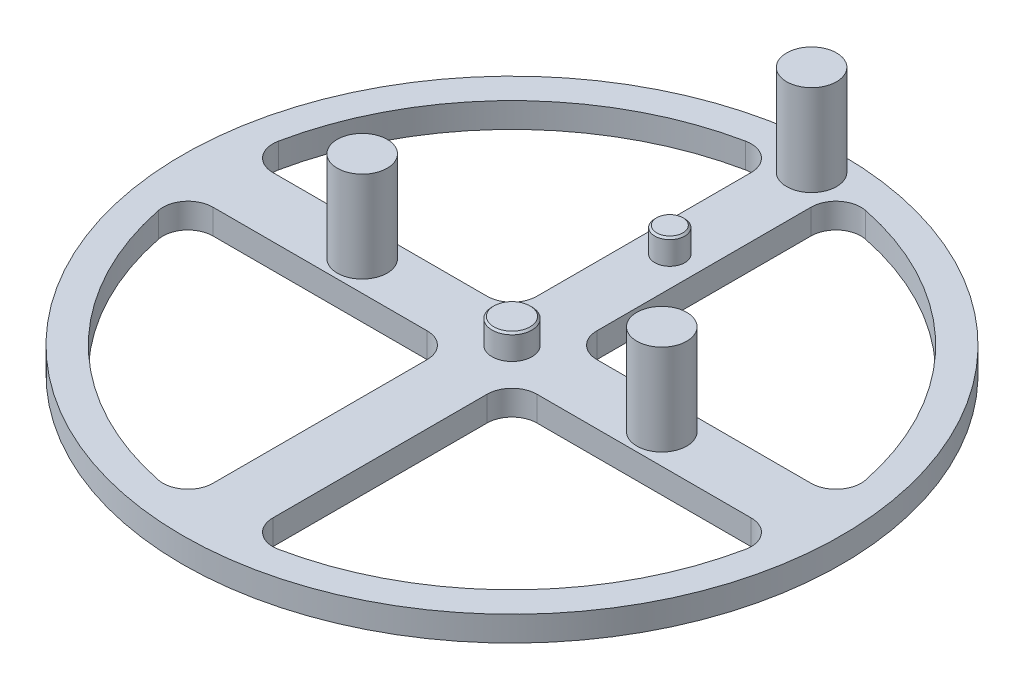
ISO-10303-21;
HEADER;
FILE_DESCRIPTION(('STEP AP214'),'2;1');
FILE_NAME('part.step','',(''),(''),'','','');
FILE_SCHEMA(('AUTOMOTIVE_DESIGN { 1 0 10303 214 1 1 1 1 }'));
ENDSEC;
DATA;
#1=APPLICATION_CONTEXT('core data for automotive mechanical design processes');
#2=APPLICATION_PROTOCOL_DEFINITION('international standard','automotive_design',2000,#1);
#3=PRODUCT_CONTEXT('',#1,'mechanical');
#4=PRODUCT('Part','Part','',(#3));
#5=PRODUCT_RELATED_PRODUCT_CATEGORY('part','',(#4));
#6=PRODUCT_DEFINITION_FORMATION('','',#4);
#7=PRODUCT_DEFINITION_CONTEXT('part definition',#1,'design');
#8=PRODUCT_DEFINITION('design','',#6,#7);
#9=PRODUCT_DEFINITION_SHAPE('','',#8);
#10=(LENGTH_UNIT() NAMED_UNIT(*) SI_UNIT(.MILLI.,.METRE.));
#11=(NAMED_UNIT(*) PLANE_ANGLE_UNIT() SI_UNIT($,.RADIAN.));
#12=(NAMED_UNIT(*) SI_UNIT($,.STERADIAN.) SOLID_ANGLE_UNIT());
#13=UNCERTAINTY_MEASURE_WITH_UNIT(LENGTH_MEASURE(1.E-05),#10,'distance_accuracy_value','');
#14=(GEOMETRIC_REPRESENTATION_CONTEXT(3) GLOBAL_UNCERTAINTY_ASSIGNED_CONTEXT((#13)) GLOBAL_UNIT_ASSIGNED_CONTEXT((#10,
#11,#12)) REPRESENTATION_CONTEXT('',''));
#15=CARTESIAN_POINT('',(0.,0.,0.));
#16=DIRECTION('',(0.,0.,1.));
#17=DIRECTION('',(1.,0.,0.));
#18=AXIS2_PLACEMENT_3D('',#15,#16,#17);
#19=CARTESIAN_POINT('',(0.,5.,0.));
#20=DIRECTION('',(0.,1.,0.));
#21=DIRECTION('',(0.,0.,1.));
#22=AXIS2_PLACEMENT_3D('',#19,#20,#21);
#23=PLANE('',#22);
#24=CARTESIAN_POINT('',(0.,5.,-60.));
#25=DIRECTION('',(0.,1.,0.));
#26=DIRECTION('',(0.,0.,1.));
#27=AXIS2_PLACEMENT_3D('',#24,#25,#26);
#28=CIRCLE('',#27,5.);
#29=CARTESIAN_POINT('',(0.,5.,-55.));
#30=VERTEX_POINT('',#29);
#31=EDGE_CURVE('E615',#30,#30,#28,.T.);
#32=ORIENTED_EDGE('',*,*,#31,.F.);
#33=EDGE_LOOP('',(#32));
#34=FACE_BOUND('',#33,.T.);
#35=CARTESIAN_POINT('',(30.,5.,0.));
#36=DIRECTION('',(0.,1.,0.));
#37=DIRECTION('',(0.,0.,1.));
#38=AXIS2_PLACEMENT_3D('',#35,#36,#37);
#39=CIRCLE('',#38,5.);
#40=CARTESIAN_POINT('',(30.,5.,5.));
#41=VERTEX_POINT('',#40);
#42=EDGE_CURVE('E11',#41,#41,#39,.T.);
#43=ORIENTED_EDGE('',*,*,#42,.F.);
#44=EDGE_LOOP('',(#43));
#45=FACE_BOUND('',#44,.T.);
#46=CARTESIAN_POINT('',(-30.,5.,0.));
#47=DIRECTION('',(0.,1.,0.));
#48=DIRECTION('',(0.,0.,1.));
#49=AXIS2_PLACEMENT_3D('',#46,#47,#48);
#50=CIRCLE('',#49,5.);
#51=CARTESIAN_POINT('',(-30.,5.,5.));
#52=VERTEX_POINT('',#51);
#53=EDGE_CURVE('E618',#52,#52,#50,.T.);
#54=ORIENTED_EDGE('',*,*,#53,.F.);
#55=EDGE_LOOP('',(#54));
#56=FACE_BOUND('',#55,.T.);
#57=CARTESIAN_POINT('',(0.,5.,-31.6));
#58=DIRECTION('',(0.,1.,0.));
#59=DIRECTION('',(0.,0.,1.));
#60=AXIS2_PLACEMENT_3D('',#57,#58,#59);
#61=CIRCLE('',#60,3.);
#62=CARTESIAN_POINT('',(0.,5.,-28.6));
#63=VERTEX_POINT('',#62);
#64=EDGE_CURVE('E626',#63,#63,#61,.T.);
#65=ORIENTED_EDGE('',*,*,#64,.F.);
#66=EDGE_LOOP('',(#65));
#67=FACE_BOUND('',#66,.T.);
#68=CARTESIAN_POINT('',(0.,5.,0.));
#69=DIRECTION('',(0.,1.,0.));
#70=DIRECTION('',(0.,0.,1.));
#71=AXIS2_PLACEMENT_3D('',#68,#69,#70);
#72=CIRCLE('',#71,4.);
#73=CARTESIAN_POINT('',(0.,5.,4.));
#74=VERTEX_POINT('',#73);
#75=EDGE_CURVE('E631',#74,#74,#72,.T.);
#76=ORIENTED_EDGE('',*,*,#75,.F.);
#77=EDGE_LOOP('',(#76));
#78=FACE_BOUND('',#77,.T.);
#79=CARTESIAN_POINT('',(0.,5.,0.));
#80=DIRECTION('',(0.,1.,0.));
#81=DIRECTION('',(0.,0.,1.));
#82=AXIS2_PLACEMENT_3D('',#79,#80,#81);
#83=CIRCLE('',#82,66.);
#84=CARTESIAN_POINT('',(0.,5.,66.));
#85=VERTEX_POINT('',#84);
#86=EDGE_CURVE('E223',#85,#85,#83,.T.);
#87=ORIENTED_EDGE('',*,*,#86,.T.);
#88=EDGE_LOOP('',(#87));
#89=FACE_BOUND('',#88,.T.);
#90=DIRECTION('',(0.,0.,-1.));
#91=VECTOR('',#90,1.);
#92=CARTESIAN_POINT('',(-6.,5.,59.6992462263972));
#93=LINE('',#92,#91);
#94=CARTESIAN_POINT('',(-6.,5.,53.8887743412299));
#95=VERTEX_POINT('',#94);
#96=CARTESIAN_POINT('',(-6.,5.,11.));
#97=VERTEX_POINT('',#96);
#98=EDGE_CURVE('E456',#95,#97,#93,.T.);
#99=ORIENTED_EDGE('',*,*,#98,.F.);
#100=CARTESIAN_POINT('',(-11.,5.,53.8887743412299));
#101=DIRECTION('',(0.,1.,0.));
#102=DIRECTION('',(0.,0.,1.));
#103=AXIS2_PLACEMENT_3D('',#100,#101,#102);
#104=CIRCLE('',#103,5.);
#105=CARTESIAN_POINT('',(-12.,5.,58.7877538267963));
#106=VERTEX_POINT('',#105);
#107=EDGE_CURVE('E286',#95,#106,#104,.F.);
#108=ORIENTED_EDGE('',*,*,#107,.T.);
#109=CARTESIAN_POINT('',(0.,5.,0.));
#110=DIRECTION('',(0.,1.,0.));
#111=DIRECTION('',(0.,0.,1.));
#112=AXIS2_PLACEMENT_3D('',#109,#110,#111);
#113=CIRCLE('',#112,60.);
#114=CARTESIAN_POINT('',(-58.7877538267963,5.,12.));
#115=VERTEX_POINT('',#114);
#116=EDGE_CURVE('E454',#115,#106,#113,.T.);
#117=ORIENTED_EDGE('',*,*,#116,.F.);
#118=CARTESIAN_POINT('',(-53.8887743412299,5.,11.));
#119=DIRECTION('',(0.,1.,0.));
#120=DIRECTION('',(0.,0.,1.));
#121=AXIS2_PLACEMENT_3D('',#118,#119,#120);
#122=CIRCLE('',#121,5.);
#123=CARTESIAN_POINT('',(-53.8887743412299,5.,5.99999999999998));
#124=VERTEX_POINT('',#123);
#125=EDGE_CURVE('E207',#115,#124,#122,.F.);
#126=ORIENTED_EDGE('',*,*,#125,.T.);
#127=DIRECTION('',(-1.,0.,0.));
#128=VECTOR('',#127,1.);
#129=CARTESIAN_POINT('',(-59.6992462263972,5.,5.99999999999998));
#130=LINE('',#129,#128);
#131=CARTESIAN_POINT('',(-11.,5.,6.));
#132=VERTEX_POINT('',#131);
#133=EDGE_CURVE('E459',#132,#124,#130,.T.);
#134=ORIENTED_EDGE('',*,*,#133,.F.);
#135=CARTESIAN_POINT('',(-11.,5.,11.));
#136=DIRECTION('',(0.,1.,0.));
#137=DIRECTION('',(0.,0.,1.));
#138=AXIS2_PLACEMENT_3D('',#135,#136,#137);
#139=CIRCLE('',#138,5.);
#140=EDGE_CURVE('E298',#132,#97,#139,.F.);
#141=ORIENTED_EDGE('',*,*,#140,.T.);
#142=EDGE_LOOP('',(#99,#108,#117,#126,#134,#141));
#143=FACE_BOUND('',#142,.T.);
#144=DIRECTION('',(1.,0.,0.));
#145=VECTOR('',#144,1.);
#146=CARTESIAN_POINT('',(-59.6992462263972,5.,-5.99999999999999));
#147=LINE('',#146,#145);
#148=CARTESIAN_POINT('',(-53.8887743412299,5.,-5.99999999999999));
#149=VERTEX_POINT('',#148);
#150=CARTESIAN_POINT('',(-11.,5.,-6.));
#151=VERTEX_POINT('',#150);
#152=EDGE_CURVE('E439',#149,#151,#147,.T.);
#153=ORIENTED_EDGE('',*,*,#152,.F.);
#154=CARTESIAN_POINT('',(-53.8887743412299,5.,-11.));
#155=DIRECTION('',(0.,1.,0.));
#156=DIRECTION('',(0.,0.,1.));
#157=AXIS2_PLACEMENT_3D('',#154,#155,#156);
#158=CIRCLE('',#157,5.);
#159=CARTESIAN_POINT('',(-58.7877538267963,5.,-12.));
#160=VERTEX_POINT('',#159);
#161=EDGE_CURVE('E48',#149,#160,#158,.F.);
#162=ORIENTED_EDGE('',*,*,#161,.T.);
#163=CARTESIAN_POINT('',(0.,5.,0.));
#164=DIRECTION('',(0.,1.,0.));
#165=DIRECTION('',(0.,0.,1.));
#166=AXIS2_PLACEMENT_3D('',#163,#164,#165);
#167=CIRCLE('',#166,60.);
#168=CARTESIAN_POINT('',(-12.,5.,-58.7877538267963));
#169=VERTEX_POINT('',#168);
#170=EDGE_CURVE('E433',#169,#160,#167,.T.);
#171=ORIENTED_EDGE('',*,*,#170,.F.);
#172=CARTESIAN_POINT('',(-11.,5.,-53.8887743412299));
#173=DIRECTION('',(0.,1.,0.));
#174=DIRECTION('',(0.,0.,1.));
#175=AXIS2_PLACEMENT_3D('',#172,#173,#174);
#176=CIRCLE('',#175,5.);
#177=CARTESIAN_POINT('',(-6.00000000000001,5.,-53.8887743412299));
#178=VERTEX_POINT('',#177);
#179=EDGE_CURVE('E325',#169,#178,#176,.F.);
#180=ORIENTED_EDGE('',*,*,#179,.T.);
#181=DIRECTION('',(0.,0.,-1.));
#182=VECTOR('',#181,1.);
#183=CARTESIAN_POINT('',(-6.,5.,-6.));
#184=LINE('',#183,#182);
#185=CARTESIAN_POINT('',(-6.,5.,-11.));
#186=VERTEX_POINT('',#185);
#187=EDGE_CURVE('E219',#186,#178,#184,.T.);
#188=ORIENTED_EDGE('',*,*,#187,.F.);
#189=CARTESIAN_POINT('',(-11.,5.,-11.));
#190=DIRECTION('',(0.,1.,0.));
#191=DIRECTION('',(0.,0.,1.));
#192=AXIS2_PLACEMENT_3D('',#189,#190,#191);
#193=CIRCLE('',#192,5.);
#194=EDGE_CURVE('E306',#186,#151,#193,.F.);
#195=ORIENTED_EDGE('',*,*,#194,.T.);
#196=EDGE_LOOP('',(#153,#162,#171,#180,#188,#195));
#197=FACE_BOUND('',#196,.T.);
#198=DIRECTION('',(-1.,0.,0.));
#199=VECTOR('',#198,1.);
#200=CARTESIAN_POINT('',(6.,5.,6.));
#201=LINE('',#200,#199);
#202=CARTESIAN_POINT('',(53.8887743412299,5.,5.99999999999998));
#203=VERTEX_POINT('',#202);
#204=CARTESIAN_POINT('',(11.,5.,6.));
#205=VERTEX_POINT('',#204);
#206=EDGE_CURVE('E656',#203,#205,#201,.T.);
#207=ORIENTED_EDGE('',*,*,#206,.F.);
#208=CARTESIAN_POINT('',(53.8887743412299,5.,11.));
#209=DIRECTION('',(0.,1.,0.));
#210=DIRECTION('',(0.,0.,1.));
#211=AXIS2_PLACEMENT_3D('',#208,#209,#210);
#212=CIRCLE('',#211,5.);
#213=CARTESIAN_POINT('',(58.7877538267963,5.,12.));
#214=VERTEX_POINT('',#213);
#215=EDGE_CURVE('E294',#203,#214,#212,.F.);
#216=ORIENTED_EDGE('',*,*,#215,.T.);
#217=CARTESIAN_POINT('',(0.,5.,0.));
#218=DIRECTION('',(0.,1.,0.));
#219=DIRECTION('',(0.,0.,1.));
#220=AXIS2_PLACEMENT_3D('',#217,#218,#219);
#221=CIRCLE('',#220,60.);
#222=CARTESIAN_POINT('',(12.,5.,58.7877538267963));
#223=VERTEX_POINT('',#222);
#224=EDGE_CURVE('E653',#223,#214,#221,.T.);
#225=ORIENTED_EDGE('',*,*,#224,.F.);
#226=CARTESIAN_POINT('',(11.,5.,53.8887743412299));
#227=DIRECTION('',(0.,1.,0.));
#228=DIRECTION('',(0.,0.,1.));
#229=AXIS2_PLACEMENT_3D('',#226,#227,#228);
#230=CIRCLE('',#229,5.);
#231=CARTESIAN_POINT('',(6.00000000000002,5.,53.8887743412299));
#232=VERTEX_POINT('',#231);
#233=EDGE_CURVE('E290',#223,#232,#230,.F.);
#234=ORIENTED_EDGE('',*,*,#233,.T.);
#235=DIRECTION('',(0.,0.,1.));
#236=VECTOR('',#235,1.);
#237=CARTESIAN_POINT('',(6.00000000000002,5.,59.6992462263972));
#238=LINE('',#237,#236);
#239=CARTESIAN_POINT('',(6.,5.,11.));
#240=VERTEX_POINT('',#239);
#241=EDGE_CURVE('E449',#240,#232,#238,.T.);
#242=ORIENTED_EDGE('',*,*,#241,.F.);
#243=CARTESIAN_POINT('',(11.,5.,11.));
#244=DIRECTION('',(0.,1.,0.));
#245=DIRECTION('',(0.,0.,1.));
#246=AXIS2_PLACEMENT_3D('',#243,#244,#245);
#247=CIRCLE('',#246,5.);
#248=EDGE_CURVE('E302',#240,#205,#247,.F.);
#249=ORIENTED_EDGE('',*,*,#248,.T.);
#250=EDGE_LOOP('',(#207,#216,#225,#234,#242,#249));
#251=FACE_BOUND('',#250,.T.);
#252=DIRECTION('',(0.,0.,1.));
#253=VECTOR('',#252,1.);
#254=CARTESIAN_POINT('',(6.,5.,-6.));
#255=LINE('',#254,#253);
#256=CARTESIAN_POINT('',(6.00000000000001,5.,-53.8887743412299));
#257=VERTEX_POINT('',#256);
#258=CARTESIAN_POINT('',(6.,5.,-11.));
#259=VERTEX_POINT('',#258);
#260=EDGE_CURVE('E638',#257,#259,#255,.T.);
#261=ORIENTED_EDGE('',*,*,#260,.F.);
#262=CARTESIAN_POINT('',(11.,5.,-53.8887743412299));
#263=DIRECTION('',(0.,1.,0.));
#264=DIRECTION('',(0.,0.,1.));
#265=AXIS2_PLACEMENT_3D('',#262,#263,#264);
#266=CIRCLE('',#265,5.);
#267=CARTESIAN_POINT('',(12.,5.,-58.7877538267963));
#268=VERTEX_POINT('',#267);
#269=EDGE_CURVE('E321',#257,#268,#266,.F.);
#270=ORIENTED_EDGE('',*,*,#269,.T.);
#271=CARTESIAN_POINT('',(0.,5.,0.));
#272=DIRECTION('',(0.,1.,0.));
#273=DIRECTION('',(0.,0.,1.));
#274=AXIS2_PLACEMENT_3D('',#271,#272,#273);
#275=CIRCLE('',#274,60.);
#276=CARTESIAN_POINT('',(58.7877538267963,5.,-12.));
#277=VERTEX_POINT('',#276);
#278=EDGE_CURVE('E635',#277,#268,#275,.T.);
#279=ORIENTED_EDGE('',*,*,#278,.F.);
#280=CARTESIAN_POINT('',(53.8887743412299,5.,-11.));
#281=DIRECTION('',(0.,1.,0.));
#282=DIRECTION('',(0.,0.,1.));
#283=AXIS2_PLACEMENT_3D('',#280,#281,#282);
#284=CIRCLE('',#283,5.);
#285=CARTESIAN_POINT('',(53.8887743412299,5.,-5.99999999999999));
#286=VERTEX_POINT('',#285);
#287=EDGE_CURVE('E208',#277,#286,#284,.F.);
#288=ORIENTED_EDGE('',*,*,#287,.T.);
#289=DIRECTION('',(1.,0.,0.));
#290=VECTOR('',#289,1.);
#291=CARTESIAN_POINT('',(6.,5.,-6.));
#292=LINE('',#291,#290);
#293=CARTESIAN_POINT('',(11.,5.,-6.));
#294=VERTEX_POINT('',#293);
#295=EDGE_CURVE('E642',#294,#286,#292,.T.);
#296=ORIENTED_EDGE('',*,*,#295,.F.);
#297=CARTESIAN_POINT('',(11.,5.,-11.));
#298=DIRECTION('',(0.,1.,0.));
#299=DIRECTION('',(0.,0.,1.));
#300=AXIS2_PLACEMENT_3D('',#297,#298,#299);
#301=CIRCLE('',#300,5.);
#302=EDGE_CURVE('E310',#294,#259,#301,.F.);
#303=ORIENTED_EDGE('',*,*,#302,.T.);
#304=EDGE_LOOP('',(#261,#270,#279,#288,#296,#303));
#305=FACE_BOUND('',#304,.T.);
#306=ADVANCED_FACE('F33',(#34,#45,#56,#67,#78,#89,#143,#197,#251,#305),#23,.T.);
#307=CARTESIAN_POINT('',(0.,0.,0.));
#308=DIRECTION('',(0.,1.,0.));
#309=DIRECTION('',(0.,0.,1.));
#310=AXIS2_PLACEMENT_3D('',#307,#308,#309);
#311=PLANE('',#310);
#312=DIRECTION('',(0.,0.,1.));
#313=VECTOR('',#312,1.);
#314=CARTESIAN_POINT('',(6.00000000000002,0.,59.6992462263972));
#315=LINE('',#314,#313);
#316=CARTESIAN_POINT('',(6.,0.,11.));
#317=VERTEX_POINT('',#316);
#318=CARTESIAN_POINT('',(6.00000000000002,0.,53.8887743412299));
#319=VERTEX_POINT('',#318);
#320=EDGE_CURVE('E657',#317,#319,#315,.T.);
#321=ORIENTED_EDGE('',*,*,#320,.T.);
#322=CARTESIAN_POINT('',(11.,0.,53.8887743412299));
#323=DIRECTION('',(0.,1.,0.));
#324=DIRECTION('',(0.,0.,1.));
#325=AXIS2_PLACEMENT_3D('',#322,#323,#324);
#326=CIRCLE('',#325,5.);
#327=CARTESIAN_POINT('',(12.,0.,58.7877538267963));
#328=VERTEX_POINT('',#327);
#329=EDGE_CURVE('E288',#319,#328,#326,.T.);
#330=ORIENTED_EDGE('',*,*,#329,.T.);
#331=CARTESIAN_POINT('',(0.,0.,0.));
#332=DIRECTION('',(0.,1.,0.));
#333=DIRECTION('',(0.,0.,1.));
#334=AXIS2_PLACEMENT_3D('',#331,#332,#333);
#335=CIRCLE('',#334,60.);
#336=CARTESIAN_POINT('',(58.7877538267963,0.,12.));
#337=VERTEX_POINT('',#336);
#338=EDGE_CURVE('E645',#328,#337,#335,.T.);
#339=ORIENTED_EDGE('',*,*,#338,.T.);
#340=CARTESIAN_POINT('',(53.8887743412299,0.,11.));
#341=DIRECTION('',(0.,1.,0.));
#342=DIRECTION('',(0.,0.,1.));
#343=AXIS2_PLACEMENT_3D('',#340,#341,#342);
#344=CIRCLE('',#343,5.);
#345=CARTESIAN_POINT('',(53.8887743412299,0.,5.99999999999998));
#346=VERTEX_POINT('',#345);
#347=EDGE_CURVE('E292',#337,#346,#344,.T.);
#348=ORIENTED_EDGE('',*,*,#347,.T.);
#349=DIRECTION('',(-1.,0.,0.));
#350=VECTOR('',#349,1.);
#351=CARTESIAN_POINT('',(6.,0.,6.));
#352=LINE('',#351,#350);
#353=CARTESIAN_POINT('',(11.,0.,6.));
#354=VERTEX_POINT('',#353);
#355=EDGE_CURVE('E664',#346,#354,#352,.T.);
#356=ORIENTED_EDGE('',*,*,#355,.T.);
#357=CARTESIAN_POINT('',(11.,0.,11.));
#358=DIRECTION('',(0.,1.,0.));
#359=DIRECTION('',(0.,0.,1.));
#360=AXIS2_PLACEMENT_3D('',#357,#358,#359);
#361=CIRCLE('',#360,5.);
#362=EDGE_CURVE('E300',#354,#317,#361,.T.);
#363=ORIENTED_EDGE('',*,*,#362,.T.);
#364=EDGE_LOOP('',(#321,#330,#339,#348,#356,#363));
#365=FACE_BOUND('',#364,.T.);
#366=DIRECTION('',(-1.,0.,0.));
#367=VECTOR('',#366,1.);
#368=CARTESIAN_POINT('',(-59.6992462263972,0.,5.99999999999998));
#369=LINE('',#368,#367);
#370=CARTESIAN_POINT('',(-11.,0.,6.));
#371=VERTEX_POINT('',#370);
#372=CARTESIAN_POINT('',(-53.8887743412299,0.,5.99999999999998));
#373=VERTEX_POINT('',#372);
#374=EDGE_CURVE('E202',#371,#373,#369,.T.);
#375=ORIENTED_EDGE('',*,*,#374,.T.);
#376=CARTESIAN_POINT('',(-53.8887743412299,0.,11.));
#377=DIRECTION('',(0.,1.,0.));
#378=DIRECTION('',(0.,0.,1.));
#379=AXIS2_PLACEMENT_3D('',#376,#377,#378);
#380=CIRCLE('',#379,5.);
#381=CARTESIAN_POINT('',(-58.7877538267963,0.,12.));
#382=VERTEX_POINT('',#381);
#383=EDGE_CURVE('E196',#373,#382,#380,.T.);
#384=ORIENTED_EDGE('',*,*,#383,.T.);
#385=CARTESIAN_POINT('',(0.,0.,0.));
#386=DIRECTION('',(0.,1.,0.));
#387=DIRECTION('',(0.,0.,1.));
#388=AXIS2_PLACEMENT_3D('',#385,#386,#387);
#389=CIRCLE('',#388,60.);
#390=CARTESIAN_POINT('',(-12.,0.,58.7877538267963));
#391=VERTEX_POINT('',#390);
#392=EDGE_CURVE('E200',#382,#391,#389,.T.);
#393=ORIENTED_EDGE('',*,*,#392,.T.);
#394=CARTESIAN_POINT('',(-11.,0.,53.8887743412299));
#395=DIRECTION('',(0.,1.,0.));
#396=DIRECTION('',(0.,0.,1.));
#397=AXIS2_PLACEMENT_3D('',#394,#395,#396);
#398=CIRCLE('',#397,5.);
#399=CARTESIAN_POINT('',(-6.,0.,53.8887743412299));
#400=VERTEX_POINT('',#399);
#401=EDGE_CURVE('E284',#391,#400,#398,.T.);
#402=ORIENTED_EDGE('',*,*,#401,.T.);
#403=DIRECTION('',(0.,0.,-1.));
#404=VECTOR('',#403,1.);
#405=CARTESIAN_POINT('',(-6.,0.,59.6992462263972));
#406=LINE('',#405,#404);
#407=CARTESIAN_POINT('',(-6.,0.,11.));
#408=VERTEX_POINT('',#407);
#409=EDGE_CURVE('E218',#400,#408,#406,.T.);
#410=ORIENTED_EDGE('',*,*,#409,.T.);
#411=CARTESIAN_POINT('',(-11.,0.,11.));
#412=DIRECTION('',(0.,1.,0.));
#413=DIRECTION('',(0.,0.,1.));
#414=AXIS2_PLACEMENT_3D('',#411,#412,#413);
#415=CIRCLE('',#414,5.);
#416=EDGE_CURVE('E296',#408,#371,#415,.T.);
#417=ORIENTED_EDGE('',*,*,#416,.T.);
#418=EDGE_LOOP('',(#375,#384,#393,#402,#410,#417));
#419=FACE_BOUND('',#418,.T.);
#420=CARTESIAN_POINT('',(0.,0.,0.));
#421=DIRECTION('',(0.,1.,0.));
#422=DIRECTION('',(0.,0.,1.));
#423=AXIS2_PLACEMENT_3D('',#420,#421,#422);
#424=CIRCLE('',#423,66.);
#425=CARTESIAN_POINT('',(0.,0.,66.));
#426=VERTEX_POINT('',#425);
#427=EDGE_CURVE('E228',#426,#426,#424,.T.);
#428=ORIENTED_EDGE('',*,*,#427,.F.);
#429=EDGE_LOOP('',(#428));
#430=FACE_BOUND('',#429,.T.);
#431=DIRECTION('',(0.,0.,-1.));
#432=VECTOR('',#431,1.);
#433=CARTESIAN_POINT('',(-6.,0.,-6.));
#434=LINE('',#433,#432);
#435=CARTESIAN_POINT('',(-6.,0.,-11.));
#436=VERTEX_POINT('',#435);
#437=CARTESIAN_POINT('',(-6.00000000000001,0.,-53.8887743412299));
#438=VERTEX_POINT('',#437);
#439=EDGE_CURVE('E452',#436,#438,#434,.T.);
#440=ORIENTED_EDGE('',*,*,#439,.T.);
#441=CARTESIAN_POINT('',(-11.,0.,-53.8887743412299));
#442=DIRECTION('',(0.,1.,0.));
#443=DIRECTION('',(0.,0.,1.));
#444=AXIS2_PLACEMENT_3D('',#441,#442,#443);
#445=CIRCLE('',#444,5.);
#446=CARTESIAN_POINT('',(-12.,0.,-58.7877538267963));
#447=VERTEX_POINT('',#446);
#448=EDGE_CURVE('E323',#438,#447,#445,.T.);
#449=ORIENTED_EDGE('',*,*,#448,.T.);
#450=CARTESIAN_POINT('',(0.,0.,0.));
#451=DIRECTION('',(0.,1.,0.));
#452=DIRECTION('',(0.,0.,1.));
#453=AXIS2_PLACEMENT_3D('',#450,#451,#452);
#454=CIRCLE('',#453,60.);
#455=CARTESIAN_POINT('',(-58.7877538267963,0.,-12.));
#456=VERTEX_POINT('',#455);
#457=EDGE_CURVE('E445',#447,#456,#454,.T.);
#458=ORIENTED_EDGE('',*,*,#457,.T.);
#459=CARTESIAN_POINT('',(-53.8887743412299,0.,-11.));
#460=DIRECTION('',(0.,1.,0.));
#461=DIRECTION('',(0.,0.,1.));
#462=AXIS2_PLACEMENT_3D('',#459,#460,#461);
#463=CIRCLE('',#462,5.);
#464=CARTESIAN_POINT('',(-53.8887743412299,0.,-5.99999999999999));
#465=VERTEX_POINT('',#464);
#466=EDGE_CURVE('E316',#456,#465,#463,.T.);
#467=ORIENTED_EDGE('',*,*,#466,.T.);
#468=DIRECTION('',(1.,0.,0.));
#469=VECTOR('',#468,1.);
#470=CARTESIAN_POINT('',(-59.6992462263972,0.,-5.99999999999999));
#471=LINE('',#470,#469);
#472=CARTESIAN_POINT('',(-11.,0.,-6.));
#473=VERTEX_POINT('',#472);
#474=EDGE_CURVE('E448',#465,#473,#471,.T.);
#475=ORIENTED_EDGE('',*,*,#474,.T.);
#476=CARTESIAN_POINT('',(-11.,0.,-11.));
#477=DIRECTION('',(0.,1.,0.));
#478=DIRECTION('',(0.,0.,1.));
#479=AXIS2_PLACEMENT_3D('',#476,#477,#478);
#480=CIRCLE('',#479,5.);
#481=EDGE_CURVE('E304',#473,#436,#480,.T.);
#482=ORIENTED_EDGE('',*,*,#481,.T.);
#483=EDGE_LOOP('',(#440,#449,#458,#467,#475,#482));
#484=FACE_BOUND('',#483,.T.);
#485=DIRECTION('',(1.,0.,0.));
#486=VECTOR('',#485,1.);
#487=CARTESIAN_POINT('',(6.,0.,-6.));
#488=LINE('',#487,#486);
#489=CARTESIAN_POINT('',(11.,0.,-6.));
#490=VERTEX_POINT('',#489);
#491=CARTESIAN_POINT('',(53.8887743412299,0.,-5.99999999999999));
#492=VERTEX_POINT('',#491);
#493=EDGE_CURVE('E639',#490,#492,#488,.T.);
#494=ORIENTED_EDGE('',*,*,#493,.T.);
#495=CARTESIAN_POINT('',(53.8887743412299,0.,-11.));
#496=DIRECTION('',(0.,1.,0.));
#497=DIRECTION('',(0.,0.,1.));
#498=AXIS2_PLACEMENT_3D('',#495,#496,#497);
#499=CIRCLE('',#498,5.);
#500=CARTESIAN_POINT('',(58.7877538267963,0.,-12.));
#501=VERTEX_POINT('',#500);
#502=EDGE_CURVE('E312',#492,#501,#499,.T.);
#503=ORIENTED_EDGE('',*,*,#502,.T.);
#504=CARTESIAN_POINT('',(0.,0.,0.));
#505=DIRECTION('',(0.,1.,0.));
#506=DIRECTION('',(0.,0.,1.));
#507=AXIS2_PLACEMENT_3D('',#504,#505,#506);
#508=CIRCLE('',#507,60.);
#509=CARTESIAN_POINT('',(12.,0.,-58.7877538267963));
#510=VERTEX_POINT('',#509);
#511=EDGE_CURVE('E634',#501,#510,#508,.T.);
#512=ORIENTED_EDGE('',*,*,#511,.T.);
#513=CARTESIAN_POINT('',(11.,0.,-53.8887743412299));
#514=DIRECTION('',(0.,1.,0.));
#515=DIRECTION('',(0.,0.,1.));
#516=AXIS2_PLACEMENT_3D('',#513,#514,#515);
#517=CIRCLE('',#516,5.);
#518=CARTESIAN_POINT('',(6.00000000000001,0.,-53.8887743412299));
#519=VERTEX_POINT('',#518);
#520=EDGE_CURVE('E319',#510,#519,#517,.T.);
#521=ORIENTED_EDGE('',*,*,#520,.T.);
#522=DIRECTION('',(0.,0.,1.));
#523=VECTOR('',#522,1.);
#524=CARTESIAN_POINT('',(6.,0.,-6.));
#525=LINE('',#524,#523);
#526=CARTESIAN_POINT('',(6.,0.,-11.));
#527=VERTEX_POINT('',#526);
#528=EDGE_CURVE('E648',#519,#527,#525,.T.);
#529=ORIENTED_EDGE('',*,*,#528,.T.);
#530=CARTESIAN_POINT('',(11.,0.,-11.));
#531=DIRECTION('',(0.,1.,0.));
#532=DIRECTION('',(0.,0.,1.));
#533=AXIS2_PLACEMENT_3D('',#530,#531,#532);
#534=CIRCLE('',#533,5.);
#535=EDGE_CURVE('E308',#527,#490,#534,.T.);
#536=ORIENTED_EDGE('',*,*,#535,.T.);
#537=EDGE_LOOP('',(#494,#503,#512,#521,#529,#536));
#538=FACE_BOUND('',#537,.T.);
#539=ADVANCED_FACE('F198',(#365,#419,#430,#484,#538),#311,.F.);
#540=CARTESIAN_POINT('',(0.,5.,0.));
#541=DIRECTION('',(0.,-1.,0.));
#542=DIRECTION('',(0.,0.,-1.));
#543=AXIS2_PLACEMENT_3D('',#540,#541,#542);
#544=CYLINDRICAL_SURFACE('',#543,66.);
#545=ORIENTED_EDGE('',*,*,#86,.F.);
#546=EDGE_LOOP('',(#545));
#547=FACE_BOUND('',#546,.T.);
#548=ORIENTED_EDGE('',*,*,#427,.T.);
#549=EDGE_LOOP('',(#548));
#550=FACE_BOUND('',#549,.T.);
#551=ADVANCED_FACE('F364',(#547,#550),#544,.T.);
#552=CARTESIAN_POINT('',(0.,5.,0.));
#553=DIRECTION('',(0.,-1.,0.));
#554=DIRECTION('',(0.,0.,-1.));
#555=AXIS2_PLACEMENT_3D('',#552,#553,#554);
#556=CYLINDRICAL_SURFACE('',#555,60.);
#557=ORIENTED_EDGE('',*,*,#116,.T.);
#558=DIRECTION('',(0.,-1.,0.));
#559=VECTOR('',#558,1.);
#560=CARTESIAN_POINT('',(-12.,5.,58.7877538267963));
#561=LINE('',#560,#559);
#562=EDGE_CURVE('E217',#106,#391,#561,.T.);
#563=ORIENTED_EDGE('',*,*,#562,.T.);
#564=ORIENTED_EDGE('',*,*,#392,.F.);
#565=DIRECTION('',(0.,-1.,0.));
#566=VECTOR('',#565,1.);
#567=CARTESIAN_POINT('',(-58.7877538267963,5.,12.));
#568=LINE('',#567,#566);
#569=EDGE_CURVE('E214',#382,#115,#568,.F.);
#570=ORIENTED_EDGE('',*,*,#569,.T.);
#571=EDGE_LOOP('',(#557,#563,#564,#570));
#572=FACE_BOUND('',#571,.T.);
#573=ADVANCED_FACE('F213',(#572),#556,.F.);
#574=CARTESIAN_POINT('',(-6.,5.,59.6992462263972));
#575=DIRECTION('',(-1.,0.,0.));
#576=DIRECTION('',(0.,0.,1.));
#577=AXIS2_PLACEMENT_3D('',#574,#575,#576);
#578=PLANE('',#577);
#579=ORIENTED_EDGE('',*,*,#409,.F.);
#580=DIRECTION('',(0.,1.,0.));
#581=VECTOR('',#580,1.);
#582=CARTESIAN_POINT('',(-6.,5.,53.8887743412299));
#583=LINE('',#582,#581);
#584=EDGE_CURVE('E234',#400,#95,#583,.T.);
#585=ORIENTED_EDGE('',*,*,#584,.T.);
#586=ORIENTED_EDGE('',*,*,#98,.T.);
#587=DIRECTION('',(0.,-1.,0.));
#588=VECTOR('',#587,1.);
#589=CARTESIAN_POINT('',(-6.,0.,11.));
#590=LINE('',#589,#588);
#591=EDGE_CURVE('E225',#97,#408,#590,.T.);
#592=ORIENTED_EDGE('',*,*,#591,.T.);
#593=EDGE_LOOP('',(#579,#585,#586,#592));
#594=FACE_BOUND('',#593,.T.);
#595=ADVANCED_FACE('F467',(#594),#578,.T.);
#596=CARTESIAN_POINT('',(-59.6992462263972,5.,5.99999999999998));
#597=DIRECTION('',(0.,0.,1.));
#598=DIRECTION('',(1.,0.,0.));
#599=AXIS2_PLACEMENT_3D('',#596,#597,#598);
#600=PLANE('',#599);
#601=ORIENTED_EDGE('',*,*,#374,.F.);
#602=DIRECTION('',(0.,-1.,0.));
#603=VECTOR('',#602,1.);
#604=CARTESIAN_POINT('',(-11.,5.,6.));
#605=LINE('',#604,#603);
#606=EDGE_CURVE('E253',#371,#132,#605,.F.);
#607=ORIENTED_EDGE('',*,*,#606,.T.);
#608=ORIENTED_EDGE('',*,*,#133,.T.);
#609=DIRECTION('',(0.,1.,0.));
#610=VECTOR('',#609,1.);
#611=CARTESIAN_POINT('',(-53.8887743412299,0.,5.99999999999998));
#612=LINE('',#611,#610);
#613=EDGE_CURVE('E251',#124,#373,#612,.F.);
#614=ORIENTED_EDGE('',*,*,#613,.T.);
#615=EDGE_LOOP('',(#601,#607,#608,#614));
#616=FACE_BOUND('',#615,.T.);
#617=ADVANCED_FACE('F476',(#616),#600,.T.);
#618=CARTESIAN_POINT('',(0.,5.,0.));
#619=DIRECTION('',(0.,-1.,0.));
#620=DIRECTION('',(0.,0.,-1.));
#621=AXIS2_PLACEMENT_3D('',#618,#619,#620);
#622=CYLINDRICAL_SURFACE('',#621,60.);
#623=ORIENTED_EDGE('',*,*,#170,.T.);
#624=DIRECTION('',(0.,-1.,0.));
#625=VECTOR('',#624,1.);
#626=CARTESIAN_POINT('',(-58.7877538267963,5.,-12.));
#627=LINE('',#626,#625);
#628=EDGE_CURVE('E281',#160,#456,#627,.T.);
#629=ORIENTED_EDGE('',*,*,#628,.T.);
#630=ORIENTED_EDGE('',*,*,#457,.F.);
#631=DIRECTION('',(0.,-1.,0.));
#632=VECTOR('',#631,1.);
#633=CARTESIAN_POINT('',(-12.,5.,-58.7877538267963));
#634=LINE('',#633,#632);
#635=EDGE_CURVE('E55',#447,#169,#634,.F.);
#636=ORIENTED_EDGE('',*,*,#635,.T.);
#637=EDGE_LOOP('',(#623,#629,#630,#636));
#638=FACE_BOUND('',#637,.T.);
#639=ADVANCED_FACE('F478',(#638),#622,.F.);
#640=CARTESIAN_POINT('',(-59.6992462263972,5.,-5.99999999999999));
#641=DIRECTION('',(0.,0.,-1.));
#642=DIRECTION('',(-1.,0.,0.));
#643=AXIS2_PLACEMENT_3D('',#640,#641,#642);
#644=PLANE('',#643);
#645=ORIENTED_EDGE('',*,*,#152,.T.);
#646=DIRECTION('',(0.,-1.,0.));
#647=VECTOR('',#646,1.);
#648=CARTESIAN_POINT('',(-11.,0.,-6.));
#649=LINE('',#648,#647);
#650=EDGE_CURVE('E257',#151,#473,#649,.T.);
#651=ORIENTED_EDGE('',*,*,#650,.T.);
#652=ORIENTED_EDGE('',*,*,#474,.F.);
#653=DIRECTION('',(0.,1.,0.));
#654=VECTOR('',#653,1.);
#655=CARTESIAN_POINT('',(-53.8887743412299,5.,-5.99999999999999));
#656=LINE('',#655,#654);
#657=EDGE_CURVE('E255',#465,#149,#656,.T.);
#658=ORIENTED_EDGE('',*,*,#657,.T.);
#659=EDGE_LOOP('',(#645,#651,#652,#658));
#660=FACE_BOUND('',#659,.T.);
#661=ADVANCED_FACE('F484',(#660),#644,.T.);
#662=CARTESIAN_POINT('',(-6.,5.,-6.));
#663=DIRECTION('',(-1.,0.,0.));
#664=DIRECTION('',(0.,0.,1.));
#665=AXIS2_PLACEMENT_3D('',#662,#663,#664);
#666=PLANE('',#665);
#667=ORIENTED_EDGE('',*,*,#439,.F.);
#668=DIRECTION('',(0.,-1.,0.));
#669=VECTOR('',#668,1.);
#670=CARTESIAN_POINT('',(-6.,5.,-11.));
#671=LINE('',#670,#669);
#672=EDGE_CURVE('E263',#436,#186,#671,.F.);
#673=ORIENTED_EDGE('',*,*,#672,.T.);
#674=ORIENTED_EDGE('',*,*,#187,.T.);
#675=DIRECTION('',(0.,1.,0.));
#676=VECTOR('',#675,1.);
#677=CARTESIAN_POINT('',(-6.00000000000001,0.,-53.8887743412299));
#678=LINE('',#677,#676);
#679=EDGE_CURVE('E260',#178,#438,#678,.F.);
#680=ORIENTED_EDGE('',*,*,#679,.T.);
#681=EDGE_LOOP('',(#667,#673,#674,#680));
#682=FACE_BOUND('',#681,.T.);
#683=ADVANCED_FACE('F436',(#682),#666,.T.);
#684=CARTESIAN_POINT('',(0.,5.,0.));
#685=DIRECTION('',(0.,-1.,0.));
#686=DIRECTION('',(0.,0.,-1.));
#687=AXIS2_PLACEMENT_3D('',#684,#685,#686);
#688=CYLINDRICAL_SURFACE('',#687,60.);
#689=ORIENTED_EDGE('',*,*,#338,.F.);
#690=DIRECTION('',(0.,-1.,0.));
#691=VECTOR('',#690,1.);
#692=CARTESIAN_POINT('',(12.,5.,58.7877538267963));
#693=LINE('',#692,#691);
#694=EDGE_CURVE('E244',#328,#223,#693,.F.);
#695=ORIENTED_EDGE('',*,*,#694,.T.);
#696=ORIENTED_EDGE('',*,*,#224,.T.);
#697=DIRECTION('',(0.,-1.,0.));
#698=VECTOR('',#697,1.);
#699=CARTESIAN_POINT('',(58.7877538267963,5.,12.));
#700=LINE('',#699,#698);
#701=EDGE_CURVE('E241',#214,#337,#700,.T.);
#702=ORIENTED_EDGE('',*,*,#701,.T.);
#703=EDGE_LOOP('',(#689,#695,#696,#702));
#704=FACE_BOUND('',#703,.T.);
#705=ADVANCED_FACE('F492',(#704),#688,.F.);
#706=CARTESIAN_POINT('',(6.,5.,6.));
#707=DIRECTION('',(0.,0.,1.));
#708=DIRECTION('',(1.,0.,0.));
#709=AXIS2_PLACEMENT_3D('',#706,#707,#708);
#710=PLANE('',#709);
#711=ORIENTED_EDGE('',*,*,#355,.F.);
#712=DIRECTION('',(0.,1.,0.));
#713=VECTOR('',#712,1.);
#714=CARTESIAN_POINT('',(53.8887743412299,5.,5.99999999999998));
#715=LINE('',#714,#713);
#716=EDGE_CURVE('E249',#346,#203,#715,.T.);
#717=ORIENTED_EDGE('',*,*,#716,.T.);
#718=ORIENTED_EDGE('',*,*,#206,.T.);
#719=DIRECTION('',(0.,-1.,0.));
#720=VECTOR('',#719,1.);
#721=CARTESIAN_POINT('',(11.,0.,6.));
#722=LINE('',#721,#720);
#723=EDGE_CURVE('E246',#205,#354,#722,.T.);
#724=ORIENTED_EDGE('',*,*,#723,.T.);
#725=EDGE_LOOP('',(#711,#717,#718,#724));
#726=FACE_BOUND('',#725,.T.);
#727=ADVANCED_FACE('F495',(#726),#710,.T.);
#728=CARTESIAN_POINT('',(6.00000000000002,5.,59.6992462263972));
#729=DIRECTION('',(1.,0.,0.));
#730=DIRECTION('',(0.,0.,-1.));
#731=AXIS2_PLACEMENT_3D('',#728,#729,#730);
#732=PLANE('',#731);
#733=ORIENTED_EDGE('',*,*,#241,.T.);
#734=DIRECTION('',(0.,1.,0.));
#735=VECTOR('',#734,1.);
#736=CARTESIAN_POINT('',(6.00000000000002,0.,53.8887743412299));
#737=LINE('',#736,#735);
#738=EDGE_CURVE('E238',#232,#319,#737,.F.);
#739=ORIENTED_EDGE('',*,*,#738,.T.);
#740=ORIENTED_EDGE('',*,*,#320,.F.);
#741=DIRECTION('',(0.,-1.,0.));
#742=VECTOR('',#741,1.);
#743=CARTESIAN_POINT('',(6.,5.,11.));
#744=LINE('',#743,#742);
#745=EDGE_CURVE('E236',#317,#240,#744,.F.);
#746=ORIENTED_EDGE('',*,*,#745,.T.);
#747=EDGE_LOOP('',(#733,#739,#740,#746));
#748=FACE_BOUND('',#747,.T.);
#749=ADVANCED_FACE('F499',(#748),#732,.T.);
#750=CARTESIAN_POINT('',(0.,5.,0.));
#751=DIRECTION('',(0.,-1.,0.));
#752=DIRECTION('',(0.,0.,-1.));
#753=AXIS2_PLACEMENT_3D('',#750,#751,#752);
#754=CYLINDRICAL_SURFACE('',#753,60.);
#755=ORIENTED_EDGE('',*,*,#511,.F.);
#756=DIRECTION('',(0.,-1.,0.));
#757=VECTOR('',#756,1.);
#758=CARTESIAN_POINT('',(58.7877538267963,5.,-12.));
#759=LINE('',#758,#757);
#760=EDGE_CURVE('E278',#501,#277,#759,.F.);
#761=ORIENTED_EDGE('',*,*,#760,.T.);
#762=ORIENTED_EDGE('',*,*,#278,.T.);
#763=DIRECTION('',(0.,-1.,0.));
#764=VECTOR('',#763,1.);
#765=CARTESIAN_POINT('',(12.,5.,-58.7877538267963));
#766=LINE('',#765,#764);
#767=EDGE_CURVE('E275',#268,#510,#766,.T.);
#768=ORIENTED_EDGE('',*,*,#767,.T.);
#769=EDGE_LOOP('',(#755,#761,#762,#768));
#770=FACE_BOUND('',#769,.T.);
#771=ADVANCED_FACE('F503',(#770),#754,.F.);
#772=CARTESIAN_POINT('',(6.,5.,-6.));
#773=DIRECTION('',(1.,0.,0.));
#774=DIRECTION('',(0.,0.,-1.));
#775=AXIS2_PLACEMENT_3D('',#772,#773,#774);
#776=PLANE('',#775);
#777=ORIENTED_EDGE('',*,*,#260,.T.);
#778=DIRECTION('',(0.,-1.,0.));
#779=VECTOR('',#778,1.);
#780=CARTESIAN_POINT('',(6.,0.,-11.));
#781=LINE('',#780,#779);
#782=EDGE_CURVE('E267',#259,#527,#781,.T.);
#783=ORIENTED_EDGE('',*,*,#782,.T.);
#784=ORIENTED_EDGE('',*,*,#528,.F.);
#785=DIRECTION('',(0.,1.,0.));
#786=VECTOR('',#785,1.);
#787=CARTESIAN_POINT('',(6.00000000000001,5.,-53.8887743412299));
#788=LINE('',#787,#786);
#789=EDGE_CURVE('E265',#519,#257,#788,.T.);
#790=ORIENTED_EDGE('',*,*,#789,.T.);
#791=EDGE_LOOP('',(#777,#783,#784,#790));
#792=FACE_BOUND('',#791,.T.);
#793=ADVANCED_FACE('F507',(#792),#776,.T.);
#794=CARTESIAN_POINT('',(6.,5.,-6.));
#795=DIRECTION('',(0.,0.,-1.));
#796=DIRECTION('',(-1.,0.,0.));
#797=AXIS2_PLACEMENT_3D('',#794,#795,#796);
#798=PLANE('',#797);
#799=ORIENTED_EDGE('',*,*,#493,.F.);
#800=DIRECTION('',(0.,-1.,0.));
#801=VECTOR('',#800,1.);
#802=CARTESIAN_POINT('',(11.,5.,-6.));
#803=LINE('',#802,#801);
#804=EDGE_CURVE('E273',#490,#294,#803,.F.);
#805=ORIENTED_EDGE('',*,*,#804,.T.);
#806=ORIENTED_EDGE('',*,*,#295,.T.);
#807=DIRECTION('',(0.,1.,0.));
#808=VECTOR('',#807,1.);
#809=CARTESIAN_POINT('',(53.8887743412299,0.,-5.99999999999999));
#810=LINE('',#809,#808);
#811=EDGE_CURVE('E270',#286,#492,#810,.F.);
#812=ORIENTED_EDGE('',*,*,#811,.T.);
#813=EDGE_LOOP('',(#799,#805,#806,#812));
#814=FACE_BOUND('',#813,.T.);
#815=ADVANCED_FACE('F379',(#814),#798,.T.);
#816=CARTESIAN_POINT('',(-11.,5.,53.8887743412299));
#817=DIRECTION('',(0.,-1.,0.));
#818=DIRECTION('',(0.,0.,-1.));
#819=AXIS2_PLACEMENT_3D('',#816,#817,#818);
#820=CYLINDRICAL_SURFACE('',#819,5.);
#821=ORIENTED_EDGE('',*,*,#107,.F.);
#822=ORIENTED_EDGE('',*,*,#584,.F.);
#823=ORIENTED_EDGE('',*,*,#401,.F.);
#824=ORIENTED_EDGE('',*,*,#562,.F.);
#825=EDGE_LOOP('',(#821,#822,#823,#824));
#826=FACE_BOUND('',#825,.T.);
#827=ADVANCED_FACE('F375',(#826),#820,.F.);
#828=CARTESIAN_POINT('',(11.,5.,53.8887743412299));
#829=DIRECTION('',(0.,-1.,0.));
#830=DIRECTION('',(0.,0.,-1.));
#831=AXIS2_PLACEMENT_3D('',#828,#829,#830);
#832=CYLINDRICAL_SURFACE('',#831,5.);
#833=ORIENTED_EDGE('',*,*,#233,.F.);
#834=ORIENTED_EDGE('',*,*,#694,.F.);
#835=ORIENTED_EDGE('',*,*,#329,.F.);
#836=ORIENTED_EDGE('',*,*,#738,.F.);
#837=EDGE_LOOP('',(#833,#834,#835,#836));
#838=FACE_BOUND('',#837,.T.);
#839=ADVANCED_FACE('F378',(#838),#832,.F.);
#840=CARTESIAN_POINT('',(53.8887743412299,5.,11.));
#841=DIRECTION('',(0.,-1.,0.));
#842=DIRECTION('',(0.,0.,-1.));
#843=AXIS2_PLACEMENT_3D('',#840,#841,#842);
#844=CYLINDRICAL_SURFACE('',#843,5.);
#845=ORIENTED_EDGE('',*,*,#215,.F.);
#846=ORIENTED_EDGE('',*,*,#716,.F.);
#847=ORIENTED_EDGE('',*,*,#347,.F.);
#848=ORIENTED_EDGE('',*,*,#701,.F.);
#849=EDGE_LOOP('',(#845,#846,#847,#848));
#850=FACE_BOUND('',#849,.T.);
#851=ADVANCED_FACE('F383',(#850),#844,.F.);
#852=CARTESIAN_POINT('',(-11.,5.,11.));
#853=DIRECTION('',(0.,1.,0.));
#854=DIRECTION('',(0.,0.,1.));
#855=AXIS2_PLACEMENT_3D('',#852,#853,#854);
#856=CYLINDRICAL_SURFACE('',#855,5.);
#857=ORIENTED_EDGE('',*,*,#140,.F.);
#858=ORIENTED_EDGE('',*,*,#606,.F.);
#859=ORIENTED_EDGE('',*,*,#416,.F.);
#860=ORIENTED_EDGE('',*,*,#591,.F.);
#861=EDGE_LOOP('',(#857,#858,#859,#860));
#862=FACE_BOUND('',#861,.T.);
#863=ADVANCED_FACE('F387',(#862),#856,.F.);
#864=CARTESIAN_POINT('',(11.,5.,11.));
#865=DIRECTION('',(0.,1.,0.));
#866=DIRECTION('',(0.,0.,1.));
#867=AXIS2_PLACEMENT_3D('',#864,#865,#866);
#868=CYLINDRICAL_SURFACE('',#867,5.);
#869=ORIENTED_EDGE('',*,*,#248,.F.);
#870=ORIENTED_EDGE('',*,*,#745,.F.);
#871=ORIENTED_EDGE('',*,*,#362,.F.);
#872=ORIENTED_EDGE('',*,*,#723,.F.);
#873=EDGE_LOOP('',(#869,#870,#871,#872));
#874=FACE_BOUND('',#873,.T.);
#875=ADVANCED_FACE('F391',(#874),#868,.F.);
#876=CARTESIAN_POINT('',(-11.,5.,-11.));
#877=DIRECTION('',(0.,1.,0.));
#878=DIRECTION('',(0.,0.,1.));
#879=AXIS2_PLACEMENT_3D('',#876,#877,#878);
#880=CYLINDRICAL_SURFACE('',#879,5.);
#881=ORIENTED_EDGE('',*,*,#194,.F.);
#882=ORIENTED_EDGE('',*,*,#672,.F.);
#883=ORIENTED_EDGE('',*,*,#481,.F.);
#884=ORIENTED_EDGE('',*,*,#650,.F.);
#885=EDGE_LOOP('',(#881,#882,#883,#884));
#886=FACE_BOUND('',#885,.T.);
#887=ADVANCED_FACE('F395',(#886),#880,.F.);
#888=CARTESIAN_POINT('',(11.,5.,-11.));
#889=DIRECTION('',(0.,1.,0.));
#890=DIRECTION('',(0.,0.,1.));
#891=AXIS2_PLACEMENT_3D('',#888,#889,#890);
#892=CYLINDRICAL_SURFACE('',#891,5.);
#893=ORIENTED_EDGE('',*,*,#302,.F.);
#894=ORIENTED_EDGE('',*,*,#804,.F.);
#895=ORIENTED_EDGE('',*,*,#535,.F.);
#896=ORIENTED_EDGE('',*,*,#782,.F.);
#897=EDGE_LOOP('',(#893,#894,#895,#896));
#898=FACE_BOUND('',#897,.T.);
#899=ADVANCED_FACE('F399',(#898),#892,.F.);
#900=CARTESIAN_POINT('',(53.8887743412299,5.,-11.));
#901=DIRECTION('',(0.,-1.,0.));
#902=DIRECTION('',(0.,0.,-1.));
#903=AXIS2_PLACEMENT_3D('',#900,#901,#902);
#904=CYLINDRICAL_SURFACE('',#903,5.);
#905=ORIENTED_EDGE('',*,*,#287,.F.);
#906=ORIENTED_EDGE('',*,*,#760,.F.);
#907=ORIENTED_EDGE('',*,*,#502,.F.);
#908=ORIENTED_EDGE('',*,*,#811,.F.);
#909=EDGE_LOOP('',(#905,#906,#907,#908));
#910=FACE_BOUND('',#909,.T.);
#911=ADVANCED_FACE('F403',(#910),#904,.F.);
#912=CARTESIAN_POINT('',(-53.8887743412299,5.,11.));
#913=DIRECTION('',(0.,-1.,0.));
#914=DIRECTION('',(0.,0.,-1.));
#915=AXIS2_PLACEMENT_3D('',#912,#913,#914);
#916=CYLINDRICAL_SURFACE('',#915,5.);
#917=ORIENTED_EDGE('',*,*,#125,.F.);
#918=ORIENTED_EDGE('',*,*,#569,.F.);
#919=ORIENTED_EDGE('',*,*,#383,.F.);
#920=ORIENTED_EDGE('',*,*,#613,.F.);
#921=EDGE_LOOP('',(#917,#918,#919,#920));
#922=FACE_BOUND('',#921,.T.);
#923=ADVANCED_FACE('F222',(#922),#916,.F.);
#924=CARTESIAN_POINT('',(-53.8887743412299,5.,-11.));
#925=DIRECTION('',(0.,-1.,0.));
#926=DIRECTION('',(0.,0.,-1.));
#927=AXIS2_PLACEMENT_3D('',#924,#925,#926);
#928=CYLINDRICAL_SURFACE('',#927,5.);
#929=ORIENTED_EDGE('',*,*,#161,.F.);
#930=ORIENTED_EDGE('',*,*,#657,.F.);
#931=ORIENTED_EDGE('',*,*,#466,.F.);
#932=ORIENTED_EDGE('',*,*,#628,.F.);
#933=EDGE_LOOP('',(#929,#930,#931,#932));
#934=FACE_BOUND('',#933,.T.);
#935=ADVANCED_FACE('F410',(#934),#928,.F.);
#936=CARTESIAN_POINT('',(11.,5.,-53.8887743412299));
#937=DIRECTION('',(0.,-1.,0.));
#938=DIRECTION('',(0.,0.,-1.));
#939=AXIS2_PLACEMENT_3D('',#936,#937,#938);
#940=CYLINDRICAL_SURFACE('',#939,5.);
#941=ORIENTED_EDGE('',*,*,#269,.F.);
#942=ORIENTED_EDGE('',*,*,#789,.F.);
#943=ORIENTED_EDGE('',*,*,#520,.F.);
#944=ORIENTED_EDGE('',*,*,#767,.F.);
#945=EDGE_LOOP('',(#941,#942,#943,#944));
#946=FACE_BOUND('',#945,.T.);
#947=ADVANCED_FACE('F413',(#946),#940,.F.);
#948=CARTESIAN_POINT('',(-11.,5.,-53.8887743412299));
#949=DIRECTION('',(0.,-1.,0.));
#950=DIRECTION('',(0.,0.,-1.));
#951=AXIS2_PLACEMENT_3D('',#948,#949,#950);
#952=CYLINDRICAL_SURFACE('',#951,5.);
#953=ORIENTED_EDGE('',*,*,#179,.F.);
#954=ORIENTED_EDGE('',*,*,#635,.F.);
#955=ORIENTED_EDGE('',*,*,#448,.F.);
#956=ORIENTED_EDGE('',*,*,#679,.F.);
#957=EDGE_LOOP('',(#953,#954,#955,#956));
#958=FACE_BOUND('',#957,.T.);
#959=ADVANCED_FACE('F417',(#958),#952,.F.);
#960=CARTESIAN_POINT('',(0.,10.,0.));
#961=DIRECTION('',(0.,-1.,0.));
#962=DIRECTION('',(0.,0.,-1.));
#963=AXIS2_PLACEMENT_3D('',#960,#961,#962);
#964=CYLINDRICAL_SURFACE('',#963,4.);
#965=CARTESIAN_POINT('',(0.,9.62500000000002,0.));
#966=DIRECTION('',(0.,1.,0.));
#967=DIRECTION('',(0.,0.,1.));
#968=AXIS2_PLACEMENT_3D('',#965,#966,#967);
#969=CIRCLE('',#968,4.);
#970=CARTESIAN_POINT('',(0.,9.62500000000002,4.));
#971=VERTEX_POINT('',#970);
#972=EDGE_CURVE('E330',#971,#971,#969,.F.);
#973=ORIENTED_EDGE('',*,*,#972,.T.);
#974=EDGE_LOOP('',(#973));
#975=FACE_BOUND('',#974,.T.);
#976=ORIENTED_EDGE('',*,*,#75,.T.);
#977=EDGE_LOOP('',(#976));
#978=FACE_BOUND('',#977,.T.);
#979=ADVANCED_FACE('F420',(#975,#978),#964,.T.);
#980=CARTESIAN_POINT('',(0.,10.,0.));
#981=DIRECTION('',(0.,1.,0.));
#982=DIRECTION('',(0.,0.,1.));
#983=AXIS2_PLACEMENT_3D('',#980,#981,#982);
#984=PLANE('',#983);
#985=CARTESIAN_POINT('',(0.,10.,0.));
#986=DIRECTION('',(0.,1.,0.));
#987=DIRECTION('',(0.,0.,1.));
#988=AXIS2_PLACEMENT_3D('',#985,#986,#987);
#989=CIRCLE('',#988,3.62500000000004);
#990=CARTESIAN_POINT('',(0.,10.,3.62500000000004));
#991=VERTEX_POINT('',#990);
#992=EDGE_CURVE('E327',#991,#991,#989,.T.);
#993=ORIENTED_EDGE('',*,*,#992,.T.);
#994=EDGE_LOOP('',(#993));
#995=FACE_BOUND('',#994,.T.);
#996=ADVANCED_FACE('F355',(#995),#984,.T.);
#997=CARTESIAN_POINT('',(0.,10.,-31.6));
#998=DIRECTION('',(0.,-1.,0.));
#999=DIRECTION('',(0.,0.,-1.));
#1000=AXIS2_PLACEMENT_3D('',#997,#998,#999);
#1001=CYLINDRICAL_SURFACE('',#1000,3.);
#1002=CARTESIAN_POINT('',(0.,9.62500000000003,-31.6));
#1003=DIRECTION('',(0.,1.,0.));
#1004=DIRECTION('',(0.,0.,1.));
#1005=AXIS2_PLACEMENT_3D('',#1002,#1003,#1004);
#1006=CIRCLE('',#1005,3.);
#1007=CARTESIAN_POINT('',(0.,9.62500000000003,-28.6));
#1008=VERTEX_POINT('',#1007);
#1009=EDGE_CURVE('E41',#1008,#1008,#1006,.F.);
#1010=ORIENTED_EDGE('',*,*,#1009,.T.);
#1011=EDGE_LOOP('',(#1010));
#1012=FACE_BOUND('',#1011,.T.);
#1013=ORIENTED_EDGE('',*,*,#64,.T.);
#1014=EDGE_LOOP('',(#1013));
#1015=FACE_BOUND('',#1014,.T.);
#1016=ADVANCED_FACE('F338',(#1012,#1015),#1001,.T.);
#1017=CARTESIAN_POINT('',(0.,10.,-31.6));
#1018=DIRECTION('',(0.,1.,0.));
#1019=DIRECTION('',(0.,0.,1.));
#1020=AXIS2_PLACEMENT_3D('',#1017,#1018,#1019);
#1021=PLANE('',#1020);
#1022=CARTESIAN_POINT('',(0.,10.,-31.6));
#1023=DIRECTION('',(0.,1.,0.));
#1024=DIRECTION('',(0.,0.,1.));
#1025=AXIS2_PLACEMENT_3D('',#1022,#1023,#1024);
#1026=CIRCLE('',#1025,2.62500000000002);
#1027=CARTESIAN_POINT('',(0.,10.,-28.975));
#1028=VERTEX_POINT('',#1027);
#1029=EDGE_CURVE('E333',#1028,#1028,#1026,.T.);
#1030=ORIENTED_EDGE('',*,*,#1029,.T.);
#1031=EDGE_LOOP('',(#1030));
#1032=FACE_BOUND('',#1031,.T.);
#1033=ADVANCED_FACE('F347',(#1032),#1021,.T.);
#1034=CARTESIAN_POINT('',(0.,10.,0.));
#1035=DIRECTION('',(0.,-1.,0.));
#1036=DIRECTION('',(0.,0.,-1.));
#1037=AXIS2_PLACEMENT_3D('',#1034,#1035,#1036);
#1038=CONICAL_SURFACE('',#1037,3.62500000000004,0.785398163397418);
#1039=ORIENTED_EDGE('',*,*,#972,.F.);
#1040=EDGE_LOOP('',(#1039));
#1041=FACE_BOUND('',#1040,.T.);
#1042=ORIENTED_EDGE('',*,*,#992,.F.);
#1043=EDGE_LOOP('',(#1042));
#1044=FACE_BOUND('',#1043,.T.);
#1045=ADVANCED_FACE('F344',(#1041,#1044),#1038,.T.);
#1046=CARTESIAN_POINT('',(0.,10.,-31.6));
#1047=DIRECTION('',(0.,-1.,0.));
#1048=DIRECTION('',(0.,0.,-1.));
#1049=AXIS2_PLACEMENT_3D('',#1046,#1047,#1048);
#1050=CONICAL_SURFACE('',#1049,2.62500000000002,0.785398163397463);
#1051=ORIENTED_EDGE('',*,*,#1009,.F.);
#1052=EDGE_LOOP('',(#1051));
#1053=FACE_BOUND('',#1052,.T.);
#1054=ORIENTED_EDGE('',*,*,#1029,.F.);
#1055=EDGE_LOOP('',(#1054));
#1056=FACE_BOUND('',#1055,.T.);
#1057=ADVANCED_FACE('F35',(#1053,#1056),#1050,.T.);
#1058=CARTESIAN_POINT('',(-30.,23.2,0.));
#1059=DIRECTION('',(0.,-1.,0.));
#1060=DIRECTION('',(0.,0.,-1.));
#1061=AXIS2_PLACEMENT_3D('',#1058,#1059,#1060);
#1062=CYLINDRICAL_SURFACE('',#1061,5.);
#1063=CARTESIAN_POINT('',(-30.,23.2,0.));
#1064=DIRECTION('',(0.,1.,0.));
#1065=DIRECTION('',(0.,0.,1.));
#1066=AXIS2_PLACEMENT_3D('',#1063,#1064,#1065);
#1067=CIRCLE('',#1066,5.);
#1068=CARTESIAN_POINT('',(-30.,23.2,5.));
#1069=VERTEX_POINT('',#1068);
#1070=EDGE_CURVE('E623',#1069,#1069,#1067,.T.);
#1071=ORIENTED_EDGE('',*,*,#1070,.F.);
#1072=EDGE_LOOP('',(#1071));
#1073=FACE_BOUND('',#1072,.T.);
#1074=ORIENTED_EDGE('',*,*,#53,.T.);
#1075=EDGE_LOOP('',(#1074));
#1076=FACE_BOUND('',#1075,.T.);
#1077=ADVANCED_FACE('F343',(#1073,#1076),#1062,.T.);
#1078=CARTESIAN_POINT('',(-30.,23.2,0.));
#1079=DIRECTION('',(0.,1.,0.));
#1080=DIRECTION('',(0.,0.,1.));
#1081=AXIS2_PLACEMENT_3D('',#1078,#1079,#1080);
#1082=PLANE('',#1081);
#1083=ORIENTED_EDGE('',*,*,#1070,.T.);
#1084=EDGE_LOOP('',(#1083));
#1085=FACE_BOUND('',#1084,.T.);
#1086=ADVANCED_FACE('F552',(#1085),#1082,.T.);
#1087=CARTESIAN_POINT('',(30.,23.2,0.));
#1088=DIRECTION('',(0.,-1.,0.));
#1089=DIRECTION('',(0.,0.,-1.));
#1090=AXIS2_PLACEMENT_3D('',#1087,#1088,#1089);
#1091=CYLINDRICAL_SURFACE('',#1090,5.);
#1092=CARTESIAN_POINT('',(30.,23.2,0.));
#1093=DIRECTION('',(0.,-1.,0.));
#1094=DIRECTION('',(0.,0.,1.));
#1095=AXIS2_PLACEMENT_3D('',#1092,#1093,#1094);
#1096=CIRCLE('',#1095,5.);
#1097=CARTESIAN_POINT('',(30.,23.2,5.));
#1098=VERTEX_POINT('',#1097);
#1099=EDGE_CURVE('E614',#1098,#1098,#1096,.T.);
#1100=ORIENTED_EDGE('',*,*,#1099,.T.);
#1101=EDGE_LOOP('',(#1100));
#1102=FACE_BOUND('',#1101,.T.);
#1103=ORIENTED_EDGE('',*,*,#42,.T.);
#1104=EDGE_LOOP('',(#1103));
#1105=FACE_BOUND('',#1104,.T.);
#1106=ADVANCED_FACE('F561',(#1102,#1105),#1091,.T.);
#1107=CARTESIAN_POINT('',(30.,23.2,0.));
#1108=DIRECTION('',(0.,1.,0.));
#1109=DIRECTION('',(0.,0.,1.));
#1110=AXIS2_PLACEMENT_3D('',#1107,#1108,#1109);
#1111=PLANE('',#1110);
#1112=ORIENTED_EDGE('',*,*,#1099,.F.);
#1113=EDGE_LOOP('',(#1112));
#1114=FACE_BOUND('',#1113,.T.);
#1115=ADVANCED_FACE('F571',(#1114),#1111,.T.);
#1116=CARTESIAN_POINT('',(0.,37.342135623731,-60.));
#1117=DIRECTION('',(0.,-1.,0.));
#1118=DIRECTION('',(0.,0.,-1.));
#1119=AXIS2_PLACEMENT_3D('',#1116,#1117,#1118);
#1120=CYLINDRICAL_SURFACE('',#1119,5.);
#1121=ORIENTED_EDGE('',*,*,#31,.T.);
#1122=EDGE_LOOP('',(#1121));
#1123=FACE_BOUND('',#1122,.T.);
#1124=CARTESIAN_POINT('',(0.,23.2,-60.));
#1125=DIRECTION('',(0.,1.,0.));
#1126=DIRECTION('',(0.,0.,1.));
#1127=AXIS2_PLACEMENT_3D('',#1124,#1125,#1126);
#1128=CIRCLE('',#1127,5.);
#1129=CARTESIAN_POINT('',(0.,23.2,-55.));
#1130=VERTEX_POINT('',#1129);
#1131=EDGE_CURVE('E612',#1130,#1130,#1128,.T.);
#1132=ORIENTED_EDGE('',*,*,#1131,.F.);
#1133=EDGE_LOOP('',(#1132));
#1134=FACE_BOUND('',#1133,.T.);
#1135=ADVANCED_FACE('F580',(#1123,#1134),#1120,.T.);
#1136=CARTESIAN_POINT('',(30.,23.2,0.));
#1137=DIRECTION('',(0.,1.,0.));
#1138=DIRECTION('',(0.,0.,1.));
#1139=AXIS2_PLACEMENT_3D('',#1136,#1137,#1138);
#1140=PLANE('',#1139);
#1141=ORIENTED_EDGE('',*,*,#1131,.T.);
#1142=EDGE_LOOP('',(#1141));
#1143=FACE_BOUND('',#1142,.T.);
#1144=ADVANCED_FACE('F596',(#1143),#1140,.T.);
#1145=CLOSED_SHELL('',(#306,#539,#551,#573,#595,#617,#639,#661,#683,#705,#727,#749,#771,#793,
#815,#827,#839,#851,#863,#875,#887,#899,#911,#923,#935,#947,#959,#979,#996,#1016,#1033,#1045,
#1057,#1077,#1086,#1106,#1115,#1135,#1144));
#1146=MANIFOLD_SOLID_BREP('B2',#1145);
#1147=ADVANCED_BREP_SHAPE_REPRESENTATION('',(#18,#1146),#14);
#1148=SHAPE_DEFINITION_REPRESENTATION(#9,#1147);
ENDSEC;
END-ISO-10303-21;
